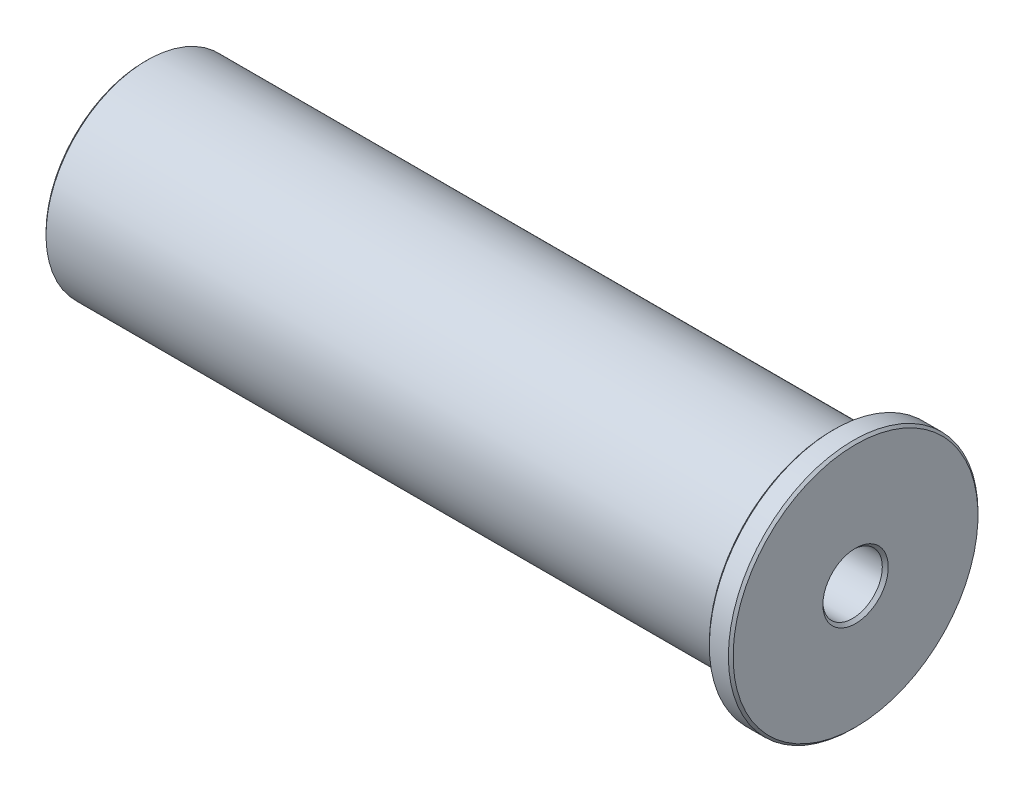
ISO-10303-21;
HEADER;
FILE_DESCRIPTION(('STEP AP214'),'2;1');
FILE_NAME('part.step','',(''),(''),'','','');
FILE_SCHEMA(('AUTOMOTIVE_DESIGN { 1 0 10303 214 1 1 1 1 }'));
ENDSEC;
DATA;
#1=APPLICATION_CONTEXT('core data for automotive mechanical design processes');
#2=APPLICATION_PROTOCOL_DEFINITION('international standard','automotive_design',2000,#1);
#3=PRODUCT_CONTEXT('',#1,'mechanical');
#4=PRODUCT('Part','Part','',(#3));
#5=PRODUCT_RELATED_PRODUCT_CATEGORY('part','',(#4));
#6=PRODUCT_DEFINITION_FORMATION('','',#4);
#7=PRODUCT_DEFINITION_CONTEXT('part definition',#1,'design');
#8=PRODUCT_DEFINITION('design','',#6,#7);
#9=PRODUCT_DEFINITION_SHAPE('','',#8);
#10=(LENGTH_UNIT() NAMED_UNIT(*) SI_UNIT(.MILLI.,.METRE.));
#11=(NAMED_UNIT(*) PLANE_ANGLE_UNIT() SI_UNIT($,.RADIAN.));
#12=(NAMED_UNIT(*) SI_UNIT($,.STERADIAN.) SOLID_ANGLE_UNIT());
#13=UNCERTAINTY_MEASURE_WITH_UNIT(LENGTH_MEASURE(1.E-05),#10,'distance_accuracy_value','');
#14=(GEOMETRIC_REPRESENTATION_CONTEXT(3) GLOBAL_UNCERTAINTY_ASSIGNED_CONTEXT((#13)) GLOBAL_UNIT_ASSIGNED_CONTEXT((#10,
#11,#12)) REPRESENTATION_CONTEXT('',''));
#15=CARTESIAN_POINT('',(0.,0.,0.));
#16=DIRECTION('',(0.,0.,1.));
#17=DIRECTION('',(1.,0.,0.));
#18=AXIS2_PLACEMENT_3D('',#15,#16,#17);
#19=CARTESIAN_POINT('',(-8.71027079588001E-13,0.,0.));
#20=DIRECTION('',(-1.,-2.04875455119457E-13,0.));
#21=DIRECTION('',(2.04875455119457E-13,-1.,0.));
#22=AXIS2_PLACEMENT_3D('',#19,#20,#21);
#23=PLANE('',#22);
#24=CARTESIAN_POINT('',(-8.71027079588001E-13,0.,0.));
#25=DIRECTION('',(-1.,-2.04875455119457E-13,0.));
#26=DIRECTION('',(2.04875455119457E-13,-1.,0.));
#27=AXIS2_PLACEMENT_3D('',#24,#25,#26);
#28=CIRCLE('',#27,8.30000000000086);
#29=CARTESIAN_POINT('',(8.29439197903669E-13,-8.30000000000086,0.));
#30=VERTEX_POINT('',#29);
#31=EDGE_CURVE('E153',#30,#30,#28,.T.);
#32=ORIENTED_EDGE('',*,*,#31,.T.);
#33=EDGE_LOOP('',(#32));
#34=FACE_BOUND('',#33,.T.);
#35=CARTESIAN_POINT('',(0.,-4.24264068711928,-4.24264068711929));
#36=DIRECTION('',(-1.,0.,0.));
#37=DIRECTION('',(0.,0.,1.));
#38=AXIS2_PLACEMENT_3D('',#35,#36,#37);
#39=CIRCLE('',#38,1.75);
#40=CARTESIAN_POINT('',(0.,-4.24264068711928,-2.49264068711929));
#41=VERTEX_POINT('',#40);
#42=EDGE_CURVE('E89',#41,#41,#39,.T.);
#43=ORIENTED_EDGE('',*,*,#42,.F.);
#44=EDGE_LOOP('',(#43));
#45=FACE_BOUND('',#44,.T.);
#46=CARTESIAN_POINT('',(0.,4.24264068711928,4.24264068711929));
#47=DIRECTION('',(-1.,0.,0.));
#48=DIRECTION('',(0.,0.,1.));
#49=AXIS2_PLACEMENT_3D('',#46,#47,#48);
#50=CIRCLE('',#49,1.75);
#51=CARTESIAN_POINT('',(0.,4.24264068711928,5.99264068711929));
#52=VERTEX_POINT('',#51);
#53=EDGE_CURVE('E82',#52,#52,#50,.T.);
#54=ORIENTED_EDGE('',*,*,#53,.F.);
#55=EDGE_LOOP('',(#54));
#56=FACE_BOUND('',#55,.T.);
#57=CARTESIAN_POINT('',(-1.22925273071673E-12,0.,6.));
#58=DIRECTION('',(-1.,0.,-2.04875455119457E-13));
#59=DIRECTION('',(-2.04875455119457E-13,0.,1.));
#60=AXIS2_PLACEMENT_3D('',#57,#58,#59);
#61=CIRCLE('',#60,1.75);
#62=CARTESIAN_POINT('',(-1.58778477717578E-12,0.,7.75));
#63=VERTEX_POINT('',#62);
#64=EDGE_CURVE('E98',#63,#63,#61,.T.);
#65=ORIENTED_EDGE('',*,*,#64,.F.);
#66=EDGE_LOOP('',(#65));
#67=FACE_BOUND('',#66,.T.);
#68=CARTESIAN_POINT('',(-2.45850546143349E-12,6.,0.));
#69=DIRECTION('',(-1.,0.,0.));
#70=DIRECTION('',(0.,0.,1.));
#71=AXIS2_PLACEMENT_3D('',#68,#69,#70);
#72=CIRCLE('',#71,1.75);
#73=CARTESIAN_POINT('',(-2.45850546143349E-12,6.,1.75));
#74=VERTEX_POINT('',#73);
#75=EDGE_CURVE('E107',#74,#74,#72,.T.);
#76=ORIENTED_EDGE('',*,*,#75,.F.);
#77=EDGE_LOOP('',(#76));
#78=FACE_BOUND('',#77,.T.);
#79=CARTESIAN_POINT('',(-1.22925273071675E-12,0.,-6.));
#80=DIRECTION('',(-1.,0.,2.04875455119457E-13));
#81=DIRECTION('',(2.04875455119457E-13,0.,1.));
#82=AXIS2_PLACEMENT_3D('',#79,#80,#81);
#83=CIRCLE('',#82,1.75);
#84=CARTESIAN_POINT('',(-8.70720684257697E-13,0.,-4.25));
#85=VERTEX_POINT('',#84);
#86=EDGE_CURVE('E116',#85,#85,#83,.T.);
#87=ORIENTED_EDGE('',*,*,#86,.F.);
#88=EDGE_LOOP('',(#87));
#89=FACE_BOUND('',#88,.T.);
#90=CARTESIAN_POINT('',(0.,-6.,0.));
#91=DIRECTION('',(-1.,0.,0.));
#92=DIRECTION('',(0.,0.,1.));
#93=AXIS2_PLACEMENT_3D('',#90,#91,#92);
#94=CIRCLE('',#93,1.75);
#95=CARTESIAN_POINT('',(0.,-6.,1.75));
#96=VERTEX_POINT('',#95);
#97=EDGE_CURVE('E125',#96,#96,#94,.T.);
#98=ORIENTED_EDGE('',*,*,#97,.F.);
#99=EDGE_LOOP('',(#98));
#100=FACE_BOUND('',#99,.T.);
#101=CARTESIAN_POINT('',(0.,0.,0.));
#102=DIRECTION('',(-1.,0.,0.));
#103=DIRECTION('',(0.,0.,1.));
#104=AXIS2_PLACEMENT_3D('',#101,#102,#103);
#105=CIRCLE('',#104,1.75);
#106=CARTESIAN_POINT('',(0.,0.,1.75));
#107=VERTEX_POINT('',#106);
#108=EDGE_CURVE('E144',#107,#107,#105,.T.);
#109=ORIENTED_EDGE('',*,*,#108,.F.);
#110=EDGE_LOOP('',(#109));
#111=FACE_BOUND('',#110,.T.);
#112=ADVANCED_FACE('F44',(#34,#45,#56,#67,#78,#89,#100,#111),#23,.T.);
#113=CARTESIAN_POINT('',(0.,0.,0.));
#114=DIRECTION('',(-1.,-2.04875455119457E-13,0.));
#115=DIRECTION('',(2.04875455119457E-13,-1.,0.));
#116=AXIS2_PLACEMENT_3D('',#113,#114,#115);
#117=CYLINDRICAL_SURFACE('',#116,8.50000000000593);
#118=CARTESIAN_POINT('',(0.200000000004205,0.,0.));
#119=DIRECTION('',(-1.,-2.04875455119457E-13,0.));
#120=DIRECTION('',(2.04875455119457E-13,-1.,0.));
#121=AXIS2_PLACEMENT_3D('',#118,#119,#120);
#122=CIRCLE('',#121,8.50000000000593);
#123=CARTESIAN_POINT('',(0.200000000005946,-8.50000000000589,0.));
#124=VERTEX_POINT('',#123);
#125=EDGE_CURVE('E158',#124,#124,#122,.F.);
#126=ORIENTED_EDGE('',*,*,#125,.T.);
#127=EDGE_LOOP('',(#126));
#128=FACE_BOUND('',#127,.T.);
#129=CARTESIAN_POINT('',(57.800430309512,1.18418894657617E-11,0.));
#130=DIRECTION('',(-1.,-2.04875455119457E-13,0.));
#131=DIRECTION('',(2.04875455119457E-13,-1.,0.));
#132=AXIS2_PLACEMENT_3D('',#129,#130,#131);
#133=CIRCLE('',#132,8.50000000001187);
#134=CARTESIAN_POINT('',(57.8004303095138,-8.50000000000003,0.));
#135=VERTEX_POINT('',#134);
#136=EDGE_CURVE('E150',#135,#135,#133,.T.);
#137=ORIENTED_EDGE('',*,*,#136,.T.);
#138=EDGE_LOOP('',(#137));
#139=FACE_BOUND('',#138,.T.);
#140=ADVANCED_FACE('F191',(#128,#139),#117,.T.);
#141=CARTESIAN_POINT('',(57.8004303095136,-8.50000000000003,0.));
#142=DIRECTION('',(-1.,-2.04875455119457E-13,0.));
#143=DIRECTION('',(2.04875455119457E-13,-1.,0.));
#144=AXIS2_PLACEMENT_3D('',#141,#142,#143);
#145=PLANE('',#144);
#146=CARTESIAN_POINT('',(57.8004303095118,1.18418894657617E-11,0.));
#147=DIRECTION('',(-1.,-2.04875455119457E-13,0.));
#148=DIRECTION('',(2.04875455119457E-13,-1.,0.));
#149=AXIS2_PLACEMENT_3D('',#146,#147,#148);
#150=CIRCLE('',#149,10.3000000000121);
#151=CARTESIAN_POINT('',(57.8004303095139,-10.3000000000002,0.));
#152=VERTEX_POINT('',#151);
#153=EDGE_CURVE('E11',#152,#152,#150,.T.);
#154=ORIENTED_EDGE('',*,*,#153,.T.);
#155=EDGE_LOOP('',(#154));
#156=FACE_BOUND('',#155,.T.);
#157=ORIENTED_EDGE('',*,*,#136,.F.);
#158=EDGE_LOOP('',(#157));
#159=FACE_BOUND('',#158,.T.);
#160=ADVANCED_FACE('F181',(#156,#159),#145,.T.);
#161=CARTESIAN_POINT('',(0.,0.,0.));
#162=DIRECTION('',(-1.,-2.04875455119457E-13,0.));
#163=DIRECTION('',(2.04875455119457E-13,-1.,0.));
#164=AXIS2_PLACEMENT_3D('',#161,#162,#163);
#165=CYLINDRICAL_SURFACE('',#164,10.500000000012);
#166=CARTESIAN_POINT('',(59.6004303095119,1.22106652849767E-11,0.));
#167=DIRECTION('',(1.,2.04875455119461E-13,0.));
#168=DIRECTION('',(-2.04875455119461E-13,1.,0.));
#169=AXIS2_PLACEMENT_3D('',#166,#167,#168);
#170=CIRCLE('',#169,10.500000000012);
#171=CARTESIAN_POINT('',(59.6004303095097,10.5000000000242,0.));
#172=VERTEX_POINT('',#171);
#173=EDGE_CURVE('E164',#172,#172,#170,.F.);
#174=ORIENTED_EDGE('',*,*,#173,.T.);
#175=EDGE_LOOP('',(#174));
#176=FACE_BOUND('',#175,.T.);
#177=CARTESIAN_POINT('',(58.0004303095118,1.18828645567856E-11,0.));
#178=DIRECTION('',(-1.,-2.04875455119454E-13,0.));
#179=DIRECTION('',(2.04875455119454E-13,-1.,0.));
#180=AXIS2_PLACEMENT_3D('',#177,#178,#179);
#181=CIRCLE('',#180,10.500000000012);
#182=CARTESIAN_POINT('',(58.000430309514,-10.5000000000001,0.));
#183=VERTEX_POINT('',#182);
#184=EDGE_CURVE('E161',#183,#183,#181,.F.);
#185=ORIENTED_EDGE('',*,*,#184,.T.);
#186=EDGE_LOOP('',(#185));
#187=FACE_BOUND('',#186,.T.);
#188=ADVANCED_FACE('F178',(#176,#187),#165,.T.);
#189=CARTESIAN_POINT('',(59.800430309512,-10.5,0.));
#190=DIRECTION('',(1.,2.04875455119457E-13,0.));
#191=DIRECTION('',(-2.04875455119457E-13,1.,0.));
#192=AXIS2_PLACEMENT_3D('',#189,#190,#191);
#193=PLANE('',#192);
#194=CARTESIAN_POINT('',(59.8004303095099,1.22516403760002E-11,0.));
#195=DIRECTION('',(1.,2.04875455119457E-13,0.));
#196=DIRECTION('',(-2.04875455119457E-13,1.,0.));
#197=AXIS2_PLACEMENT_3D('',#194,#195,#196);
#198=CIRCLE('',#197,10.300000000014);
#199=CARTESIAN_POINT('',(59.8004303095078,10.3000000000263,0.));
#200=VERTEX_POINT('',#199);
#201=EDGE_CURVE('E53',#200,#200,#198,.T.);
#202=ORIENTED_EDGE('',*,*,#201,.T.);
#203=EDGE_LOOP('',(#202));
#204=FACE_BOUND('',#203,.T.);
#205=CARTESIAN_POINT('',(59.8004303095099,1.22516403760002E-11,0.));
#206=DIRECTION('',(1.,0.,0.));
#207=DIRECTION('',(0.,0.,-1.));
#208=AXIS2_PLACEMENT_3D('',#205,#206,#207);
#209=CIRCLE('',#208,2.75);
#210=CARTESIAN_POINT('',(59.8004303095099,1.22516403760002E-11,-2.75));
#211=VERTEX_POINT('',#210);
#212=EDGE_CURVE('E134',#211,#211,#209,.T.);
#213=ORIENTED_EDGE('',*,*,#212,.F.);
#214=EDGE_LOOP('',(#213));
#215=FACE_BOUND('',#214,.T.);
#216=ADVANCED_FACE('F169',(#204,#215),#193,.T.);
#217=CARTESIAN_POINT('',(0.,0.,0.));
#218=DIRECTION('',(-1.,0.,0.));
#219=DIRECTION('',(0.,0.,1.));
#220=AXIS2_PLACEMENT_3D('',#217,#218,#219);
#221=CYLINDRICAL_SURFACE('',#220,1.49999999999999);
#222=CARTESIAN_POINT('',(12.,1.22516403760002E-11,0.));
#223=DIRECTION('',(1.,0.,0.));
#224=DIRECTION('',(0.,0.,-1.));
#225=AXIS2_PLACEMENT_3D('',#222,#223,#224);
#226=CIRCLE('',#225,1.49999999999999);
#227=CARTESIAN_POINT('',(12.,1.22516403760002E-11,-1.49999999999999));
#228=VERTEX_POINT('',#227);
#229=EDGE_CURVE('E143',#228,#228,#226,.T.);
#230=ORIENTED_EDGE('',*,*,#229,.T.);
#231=EDGE_LOOP('',(#230));
#232=FACE_BOUND('',#231,.T.);
#233=CARTESIAN_POINT('',(0.250000000000007,0.,0.));
#234=DIRECTION('',(-1.,0.,0.));
#235=DIRECTION('',(0.,0.,1.));
#236=AXIS2_PLACEMENT_3D('',#233,#234,#235);
#237=CIRCLE('',#236,1.49999999999999);
#238=CARTESIAN_POINT('',(0.250000000000007,0.,1.49999999999999));
#239=VERTEX_POINT('',#238);
#240=EDGE_CURVE('E147',#239,#239,#237,.T.);
#241=ORIENTED_EDGE('',*,*,#240,.T.);
#242=EDGE_LOOP('',(#241));
#243=FACE_BOUND('',#242,.T.);
#244=ADVANCED_FACE('F242',(#232,#243),#221,.F.);
#245=CARTESIAN_POINT('',(0.,0.,0.));
#246=DIRECTION('',(-1.,0.,0.));
#247=DIRECTION('',(0.,0.,1.));
#248=AXIS2_PLACEMENT_3D('',#245,#246,#247);
#249=CONICAL_SURFACE('',#248,1.75,0.785398163397449);
#250=ORIENTED_EDGE('',*,*,#240,.F.);
#251=EDGE_LOOP('',(#250));
#252=FACE_BOUND('',#251,.T.);
#253=ORIENTED_EDGE('',*,*,#108,.T.);
#254=EDGE_LOOP('',(#253));
#255=FACE_BOUND('',#254,.T.);
#256=ADVANCED_FACE('F239',(#252,#255),#249,.F.);
#257=CARTESIAN_POINT('',(12.6008606190276,1.22516403760002E-11,0.));
#258=DIRECTION('',(1.,0.,0.));
#259=DIRECTION('',(0.,0.,-1.));
#260=AXIS2_PLACEMENT_3D('',#257,#258,#259);
#261=CONICAL_SURFACE('',#260,2.49999999999999,1.02974425867665);
#262=CARTESIAN_POINT('',(12.6008606190276,1.22516403760002E-11,0.));
#263=DIRECTION('',(1.,0.,0.));
#264=DIRECTION('',(0.,0.,-1.));
#265=AXIS2_PLACEMENT_3D('',#262,#263,#264);
#266=CIRCLE('',#265,2.49999999999999);
#267=CARTESIAN_POINT('',(12.6008606190276,1.22516403760002E-11,-2.49999999999999));
#268=VERTEX_POINT('',#267);
#269=EDGE_CURVE('E140',#268,#268,#266,.T.);
#270=ORIENTED_EDGE('',*,*,#269,.T.);
#271=EDGE_LOOP('',(#270));
#272=FACE_BOUND('',#271,.T.);
#273=ORIENTED_EDGE('',*,*,#229,.F.);
#274=EDGE_LOOP('',(#273));
#275=FACE_BOUND('',#274,.T.);
#276=ADVANCED_FACE('F241',(#272,#275),#261,.F.);
#277=CARTESIAN_POINT('',(59.8004303095099,1.22516403760002E-11,0.));
#278=DIRECTION('',(1.,0.,0.));
#279=DIRECTION('',(0.,0.,-1.));
#280=AXIS2_PLACEMENT_3D('',#277,#278,#279);
#281=CYLINDRICAL_SURFACE('',#280,2.49999999999999);
#282=ORIENTED_EDGE('',*,*,#269,.F.);
#283=EDGE_LOOP('',(#282));
#284=FACE_BOUND('',#283,.T.);
#285=CARTESIAN_POINT('',(59.5504303095099,1.22516403760002E-11,0.));
#286=DIRECTION('',(1.,0.,0.));
#287=DIRECTION('',(0.,0.,-1.));
#288=AXIS2_PLACEMENT_3D('',#285,#286,#287);
#289=CIRCLE('',#288,2.49999999999999);
#290=CARTESIAN_POINT('',(59.5504303095099,1.22516403760002E-11,-2.49999999999999));
#291=VERTEX_POINT('',#290);
#292=EDGE_CURVE('E137',#291,#291,#289,.T.);
#293=ORIENTED_EDGE('',*,*,#292,.T.);
#294=EDGE_LOOP('',(#293));
#295=FACE_BOUND('',#294,.T.);
#296=ADVANCED_FACE('F249',(#284,#295),#281,.F.);
#297=CARTESIAN_POINT('',(59.8004303095099,1.22516403760002E-11,0.));
#298=DIRECTION('',(1.,0.,0.));
#299=DIRECTION('',(0.,0.,-1.));
#300=AXIS2_PLACEMENT_3D('',#297,#298,#299);
#301=CONICAL_SURFACE('',#300,2.75,0.785398163397459);
#302=ORIENTED_EDGE('',*,*,#292,.F.);
#303=EDGE_LOOP('',(#302));
#304=FACE_BOUND('',#303,.T.);
#305=ORIENTED_EDGE('',*,*,#212,.T.);
#306=EDGE_LOOP('',(#305));
#307=FACE_BOUND('',#306,.T.);
#308=ADVANCED_FACE('F283',(#304,#307),#301,.F.);
#309=CARTESIAN_POINT('',(8.5,-6.,0.));
#310=DIRECTION('',(-1.,0.,0.));
#311=DIRECTION('',(0.,0.,1.));
#312=AXIS2_PLACEMENT_3D('',#309,#310,#311);
#313=CONICAL_SURFACE('',#312,1.25,1.02974425867665);
#314=CARTESIAN_POINT('',(9.25107577378445,-6.,0.));
#315=VERTEX_POINT('',#314);
#316=VERTEX_LOOP('',#315);
#317=FACE_BOUND('',#316,.T.);
#318=CARTESIAN_POINT('',(8.5,-6.,0.));
#319=DIRECTION('',(-1.,0.,0.));
#320=DIRECTION('',(0.,0.,1.));
#321=AXIS2_PLACEMENT_3D('',#318,#319,#320);
#322=CIRCLE('',#321,1.25);
#323=CARTESIAN_POINT('',(8.5,-6.,1.25));
#324=VERTEX_POINT('',#323);
#325=EDGE_CURVE('E131',#324,#324,#322,.T.);
#326=ORIENTED_EDGE('',*,*,#325,.T.);
#327=EDGE_LOOP('',(#326));
#328=FACE_BOUND('',#327,.T.);
#329=ADVANCED_FACE('F292',(#317,#328),#313,.F.);
#330=CARTESIAN_POINT('',(0.,-6.,0.));
#331=DIRECTION('',(-1.,0.,0.));
#332=DIRECTION('',(0.,0.,1.));
#333=AXIS2_PLACEMENT_3D('',#330,#331,#332);
#334=CYLINDRICAL_SURFACE('',#333,1.25);
#335=ORIENTED_EDGE('',*,*,#325,.F.);
#336=EDGE_LOOP('',(#335));
#337=FACE_BOUND('',#336,.T.);
#338=CARTESIAN_POINT('',(0.500000000000001,-6.,0.));
#339=DIRECTION('',(-1.,0.,0.));
#340=DIRECTION('',(0.,0.,1.));
#341=AXIS2_PLACEMENT_3D('',#338,#339,#340);
#342=CIRCLE('',#341,1.25);
#343=CARTESIAN_POINT('',(0.500000000000001,-6.,1.25));
#344=VERTEX_POINT('',#343);
#345=EDGE_CURVE('E128',#344,#344,#342,.T.);
#346=ORIENTED_EDGE('',*,*,#345,.T.);
#347=EDGE_LOOP('',(#346));
#348=FACE_BOUND('',#347,.T.);
#349=ADVANCED_FACE('F302',(#337,#348),#334,.F.);
#350=CARTESIAN_POINT('',(0.,-6.,0.));
#351=DIRECTION('',(-1.,0.,0.));
#352=DIRECTION('',(0.,0.,1.));
#353=AXIS2_PLACEMENT_3D('',#350,#351,#352);
#354=CONICAL_SURFACE('',#353,1.75,0.785398163397447);
#355=ORIENTED_EDGE('',*,*,#345,.F.);
#356=EDGE_LOOP('',(#355));
#357=FACE_BOUND('',#356,.T.);
#358=ORIENTED_EDGE('',*,*,#97,.T.);
#359=EDGE_LOOP('',(#358));
#360=FACE_BOUND('',#359,.T.);
#361=ADVANCED_FACE('F312',(#357,#360),#354,.F.);
#362=CARTESIAN_POINT('',(8.49999999999877,0.,-6.00000000000174));
#363=DIRECTION('',(-1.,0.,2.04875455119457E-13));
#364=DIRECTION('',(2.04875455119457E-13,0.,1.));
#365=AXIS2_PLACEMENT_3D('',#362,#363,#364);
#366=CONICAL_SURFACE('',#365,1.25,1.02974425867665);
#367=CARTESIAN_POINT('',(9.25107577378322,0.,-6.00000000000189));
#368=VERTEX_POINT('',#367);
#369=VERTEX_LOOP('',#368);
#370=FACE_BOUND('',#369,.T.);
#371=CARTESIAN_POINT('',(8.49999999999877,0.,-6.00000000000174));
#372=DIRECTION('',(-1.,0.,2.04875455119457E-13));
#373=DIRECTION('',(2.04875455119457E-13,0.,1.));
#374=AXIS2_PLACEMENT_3D('',#371,#372,#373);
#375=CIRCLE('',#374,1.25);
#376=CARTESIAN_POINT('',(8.49999999999903,0.,-4.75000000000174));
#377=VERTEX_POINT('',#376);
#378=EDGE_CURVE('E122',#377,#377,#375,.T.);
#379=ORIENTED_EDGE('',*,*,#378,.T.);
#380=EDGE_LOOP('',(#379));
#381=FACE_BOUND('',#380,.T.);
#382=ADVANCED_FACE('F326',(#370,#381),#366,.F.);
#383=CARTESIAN_POINT('',(-1.22925273071675E-12,0.,-6.));
#384=DIRECTION('',(-1.,0.,2.04875455119457E-13));
#385=DIRECTION('',(2.04875455119457E-13,0.,1.));
#386=AXIS2_PLACEMENT_3D('',#383,#384,#385);
#387=CYLINDRICAL_SURFACE('',#386,1.25);
#388=ORIENTED_EDGE('',*,*,#378,.F.);
#389=EDGE_LOOP('',(#388));
#390=FACE_BOUND('',#389,.T.);
#391=CARTESIAN_POINT('',(0.499999999998772,0.,-6.0000000000001));
#392=DIRECTION('',(-1.,0.,2.04875455119457E-13));
#393=DIRECTION('',(2.04875455119457E-13,0.,1.));
#394=AXIS2_PLACEMENT_3D('',#391,#392,#393);
#395=CIRCLE('',#394,1.25);
#396=CARTESIAN_POINT('',(0.499999999999028,0.,-4.7500000000001));
#397=VERTEX_POINT('',#396);
#398=EDGE_CURVE('E119',#397,#397,#395,.T.);
#399=ORIENTED_EDGE('',*,*,#398,.T.);
#400=EDGE_LOOP('',(#399));
#401=FACE_BOUND('',#400,.T.);
#402=ADVANCED_FACE('F337',(#390,#401),#387,.F.);
#403=CARTESIAN_POINT('',(-1.22925273071675E-12,0.,-6.));
#404=DIRECTION('',(-1.,0.,2.04875455119457E-13));
#405=DIRECTION('',(2.04875455119457E-13,0.,1.));
#406=AXIS2_PLACEMENT_3D('',#403,#404,#405);
#407=CONICAL_SURFACE('',#406,1.75,0.785398163397448);
#408=ORIENTED_EDGE('',*,*,#398,.F.);
#409=EDGE_LOOP('',(#408));
#410=FACE_BOUND('',#409,.T.);
#411=ORIENTED_EDGE('',*,*,#86,.T.);
#412=EDGE_LOOP('',(#411));
#413=FACE_BOUND('',#412,.T.);
#414=ADVANCED_FACE('F347',(#410,#413),#407,.F.);
#415=CARTESIAN_POINT('',(8.49999999999754,6.,0.));
#416=DIRECTION('',(-1.,0.,0.));
#417=DIRECTION('',(0.,0.,1.));
#418=AXIS2_PLACEMENT_3D('',#415,#416,#417);
#419=CONICAL_SURFACE('',#418,1.25,1.02974425867665);
#420=CARTESIAN_POINT('',(9.251075773782,6.,0.));
#421=VERTEX_POINT('',#420);
#422=VERTEX_LOOP('',#421);
#423=FACE_BOUND('',#422,.T.);
#424=CARTESIAN_POINT('',(8.49999999999754,6.,0.));
#425=DIRECTION('',(-1.,0.,0.));
#426=DIRECTION('',(0.,0.,1.));
#427=AXIS2_PLACEMENT_3D('',#424,#425,#426);
#428=CIRCLE('',#427,1.25);
#429=CARTESIAN_POINT('',(8.49999999999754,6.,1.25));
#430=VERTEX_POINT('',#429);
#431=EDGE_CURVE('E113',#430,#430,#428,.T.);
#432=ORIENTED_EDGE('',*,*,#431,.T.);
#433=EDGE_LOOP('',(#432));
#434=FACE_BOUND('',#433,.T.);
#435=ADVANCED_FACE('F361',(#423,#434),#419,.F.);
#436=CARTESIAN_POINT('',(-2.45850546143349E-12,6.,0.));
#437=DIRECTION('',(-1.,0.,0.));
#438=DIRECTION('',(0.,0.,1.));
#439=AXIS2_PLACEMENT_3D('',#436,#437,#438);
#440=CYLINDRICAL_SURFACE('',#439,1.25);
#441=ORIENTED_EDGE('',*,*,#431,.F.);
#442=EDGE_LOOP('',(#441));
#443=FACE_BOUND('',#442,.T.);
#444=CARTESIAN_POINT('',(0.499999999997543,6.,0.));
#445=DIRECTION('',(-1.,0.,0.));
#446=DIRECTION('',(0.,0.,1.));
#447=AXIS2_PLACEMENT_3D('',#444,#445,#446);
#448=CIRCLE('',#447,1.25);
#449=CARTESIAN_POINT('',(0.499999999997543,6.,1.25));
#450=VERTEX_POINT('',#449);
#451=EDGE_CURVE('E110',#450,#450,#448,.T.);
#452=ORIENTED_EDGE('',*,*,#451,.T.);
#453=EDGE_LOOP('',(#452));
#454=FACE_BOUND('',#453,.T.);
#455=ADVANCED_FACE('F373',(#443,#454),#440,.F.);
#456=CARTESIAN_POINT('',(-2.45850546143349E-12,6.,0.));
#457=DIRECTION('',(-1.,0.,0.));
#458=DIRECTION('',(0.,0.,1.));
#459=AXIS2_PLACEMENT_3D('',#456,#457,#458);
#460=CONICAL_SURFACE('',#459,1.75,0.785398163397447);
#461=ORIENTED_EDGE('',*,*,#451,.F.);
#462=EDGE_LOOP('',(#461));
#463=FACE_BOUND('',#462,.T.);
#464=ORIENTED_EDGE('',*,*,#75,.T.);
#465=EDGE_LOOP('',(#464));
#466=FACE_BOUND('',#465,.T.);
#467=ADVANCED_FACE('F384',(#463,#466),#460,.F.);
#468=CARTESIAN_POINT('',(8.49999999999877,0.,6.00000000000174));
#469=DIRECTION('',(-1.,0.,-2.04875455119457E-13));
#470=DIRECTION('',(-2.04875455119457E-13,0.,1.));
#471=AXIS2_PLACEMENT_3D('',#468,#469,#470);
#472=CONICAL_SURFACE('',#471,1.25,1.02974425867665);
#473=CARTESIAN_POINT('',(9.25107577378322,0.,6.00000000000189));
#474=VERTEX_POINT('',#473);
#475=VERTEX_LOOP('',#474);
#476=FACE_BOUND('',#475,.T.);
#477=CARTESIAN_POINT('',(8.49999999999877,0.,6.00000000000174));
#478=DIRECTION('',(-1.,0.,-2.04875455119457E-13));
#479=DIRECTION('',(-2.04875455119457E-13,0.,1.));
#480=AXIS2_PLACEMENT_3D('',#477,#478,#479);
#481=CIRCLE('',#480,1.25);
#482=CARTESIAN_POINT('',(8.49999999999851,0.,7.25000000000174));
#483=VERTEX_POINT('',#482);
#484=EDGE_CURVE('E104',#483,#483,#481,.T.);
#485=ORIENTED_EDGE('',*,*,#484,.T.);
#486=EDGE_LOOP('',(#485));
#487=FACE_BOUND('',#486,.T.);
#488=ADVANCED_FACE('F395',(#476,#487),#472,.F.);
#489=CARTESIAN_POINT('',(-1.22925273071673E-12,0.,6.));
#490=DIRECTION('',(-1.,0.,-2.04875455119457E-13));
#491=DIRECTION('',(-2.04875455119457E-13,0.,1.));
#492=AXIS2_PLACEMENT_3D('',#489,#490,#491);
#493=CYLINDRICAL_SURFACE('',#492,1.25);
#494=ORIENTED_EDGE('',*,*,#484,.F.);
#495=EDGE_LOOP('',(#494));
#496=FACE_BOUND('',#495,.T.);
#497=CARTESIAN_POINT('',(0.499999999998772,0.,6.0000000000001));
#498=DIRECTION('',(-1.,0.,-2.04875455119457E-13));
#499=DIRECTION('',(-2.04875455119457E-13,0.,1.));
#500=AXIS2_PLACEMENT_3D('',#497,#498,#499);
#501=CIRCLE('',#500,1.25);
#502=CARTESIAN_POINT('',(0.499999999998516,0.,7.2500000000001));
#503=VERTEX_POINT('',#502);
#504=EDGE_CURVE('E101',#503,#503,#501,.T.);
#505=ORIENTED_EDGE('',*,*,#504,.T.);
#506=EDGE_LOOP('',(#505));
#507=FACE_BOUND('',#506,.T.);
#508=ADVANCED_FACE('F406',(#496,#507),#493,.F.);
#509=CARTESIAN_POINT('',(-1.22925273071673E-12,0.,6.));
#510=DIRECTION('',(-1.,0.,-2.04875455119457E-13));
#511=DIRECTION('',(-2.04875455119457E-13,0.,1.));
#512=AXIS2_PLACEMENT_3D('',#509,#510,#511);
#513=CONICAL_SURFACE('',#512,1.75,0.785398163397448);
#514=ORIENTED_EDGE('',*,*,#504,.F.);
#515=EDGE_LOOP('',(#514));
#516=FACE_BOUND('',#515,.T.);
#517=ORIENTED_EDGE('',*,*,#64,.T.);
#518=EDGE_LOOP('',(#517));
#519=FACE_BOUND('',#518,.T.);
#520=ADVANCED_FACE('F416',(#516,#519),#513,.F.);
#521=CARTESIAN_POINT('',(8.,4.24264068711928,4.24264068711929));
#522=DIRECTION('',(-1.,0.,0.));
#523=DIRECTION('',(0.,0.,1.));
#524=AXIS2_PLACEMENT_3D('',#521,#522,#523);
#525=CONICAL_SURFACE('',#524,1.5,1.02974425867665);
#526=CARTESIAN_POINT('',(8.90129092854134,4.24264068711928,4.24264068711929));
#527=VERTEX_POINT('',#526);
#528=VERTEX_LOOP('',#527);
#529=FACE_BOUND('',#528,.T.);
#530=CARTESIAN_POINT('',(8.,4.24264068711928,4.24264068711929));
#531=DIRECTION('',(-1.,0.,0.));
#532=DIRECTION('',(0.,0.,1.));
#533=AXIS2_PLACEMENT_3D('',#530,#531,#532);
#534=CIRCLE('',#533,1.5);
#535=CARTESIAN_POINT('',(8.,4.24264068711928,5.74264068711929));
#536=VERTEX_POINT('',#535);
#537=EDGE_CURVE('E95',#536,#536,#534,.T.);
#538=ORIENTED_EDGE('',*,*,#537,.T.);
#539=EDGE_LOOP('',(#538));
#540=FACE_BOUND('',#539,.T.);
#541=ADVANCED_FACE('F427',(#529,#540),#525,.F.);
#542=CARTESIAN_POINT('',(0.,4.24264068711928,4.24264068711929));
#543=DIRECTION('',(-1.,0.,0.));
#544=DIRECTION('',(0.,0.,1.));
#545=AXIS2_PLACEMENT_3D('',#542,#543,#544);
#546=CYLINDRICAL_SURFACE('',#545,1.5);
#547=ORIENTED_EDGE('',*,*,#537,.F.);
#548=EDGE_LOOP('',(#547));
#549=FACE_BOUND('',#548,.T.);
#550=CARTESIAN_POINT('',(0.25,4.24264068711928,4.24264068711929));
#551=DIRECTION('',(-1.,0.,0.));
#552=DIRECTION('',(0.,0.,1.));
#553=AXIS2_PLACEMENT_3D('',#550,#551,#552);
#554=CIRCLE('',#553,1.5);
#555=CARTESIAN_POINT('',(0.25,4.24264068711928,5.74264068711929));
#556=VERTEX_POINT('',#555);
#557=EDGE_CURVE('E86',#556,#556,#554,.T.);
#558=ORIENTED_EDGE('',*,*,#557,.T.);
#559=EDGE_LOOP('',(#558));
#560=FACE_BOUND('',#559,.T.);
#561=ADVANCED_FACE('F438',(#549,#560),#546,.F.);
#562=CARTESIAN_POINT('',(0.,4.24264068711928,4.24264068711929));
#563=DIRECTION('',(-1.,0.,0.));
#564=DIRECTION('',(0.,0.,1.));
#565=AXIS2_PLACEMENT_3D('',#562,#563,#564);
#566=CONICAL_SURFACE('',#565,1.75,0.78539816339745);
#567=ORIENTED_EDGE('',*,*,#557,.F.);
#568=EDGE_LOOP('',(#567));
#569=FACE_BOUND('',#568,.T.);
#570=ORIENTED_EDGE('',*,*,#53,.T.);
#571=EDGE_LOOP('',(#570));
#572=FACE_BOUND('',#571,.T.);
#573=ADVANCED_FACE('F76',(#569,#572),#566,.F.);
#574=CARTESIAN_POINT('',(8.,-4.24264068711928,-4.24264068711929));
#575=DIRECTION('',(-1.,0.,0.));
#576=DIRECTION('',(0.,0.,1.));
#577=AXIS2_PLACEMENT_3D('',#574,#575,#576);
#578=CONICAL_SURFACE('',#577,1.5,1.02974425867665);
#579=CARTESIAN_POINT('',(8.90129092854134,-4.24264068711928,-4.24264068711929));
#580=VERTEX_POINT('',#579);
#581=VERTEX_LOOP('',#580);
#582=FACE_BOUND('',#581,.T.);
#583=CARTESIAN_POINT('',(8.,-4.24264068711928,-4.24264068711929));
#584=DIRECTION('',(-1.,0.,0.));
#585=DIRECTION('',(0.,0.,1.));
#586=AXIS2_PLACEMENT_3D('',#583,#584,#585);
#587=CIRCLE('',#586,1.5);
#588=CARTESIAN_POINT('',(8.,-4.24264068711928,-2.74264068711929));
#589=VERTEX_POINT('',#588);
#590=EDGE_CURVE('E80',#589,#589,#587,.T.);
#591=ORIENTED_EDGE('',*,*,#590,.T.);
#592=EDGE_LOOP('',(#591));
#593=FACE_BOUND('',#592,.T.);
#594=ADVANCED_FACE('F72',(#582,#593),#578,.F.);
#595=CARTESIAN_POINT('',(0.,-4.24264068711928,-4.24264068711929));
#596=DIRECTION('',(-1.,0.,0.));
#597=DIRECTION('',(0.,0.,1.));
#598=AXIS2_PLACEMENT_3D('',#595,#596,#597);
#599=CYLINDRICAL_SURFACE('',#598,1.5);
#600=ORIENTED_EDGE('',*,*,#590,.F.);
#601=EDGE_LOOP('',(#600));
#602=FACE_BOUND('',#601,.T.);
#603=CARTESIAN_POINT('',(0.25,-4.24264068711928,-4.24264068711929));
#604=DIRECTION('',(-1.,0.,0.));
#605=DIRECTION('',(0.,0.,1.));
#606=AXIS2_PLACEMENT_3D('',#603,#604,#605);
#607=CIRCLE('',#606,1.5);
#608=CARTESIAN_POINT('',(0.25,-4.24264068711928,-2.74264068711929));
#609=VERTEX_POINT('',#608);
#610=EDGE_CURVE('E83',#609,#609,#607,.T.);
#611=ORIENTED_EDGE('',*,*,#610,.T.);
#612=EDGE_LOOP('',(#611));
#613=FACE_BOUND('',#612,.T.);
#614=ADVANCED_FACE('F75',(#602,#613),#599,.F.);
#615=CARTESIAN_POINT('',(0.,-4.24264068711928,-4.24264068711929));
#616=DIRECTION('',(-1.,0.,0.));
#617=DIRECTION('',(0.,0.,1.));
#618=AXIS2_PLACEMENT_3D('',#615,#616,#617);
#619=CONICAL_SURFACE('',#618,1.75,0.785398163397449);
#620=ORIENTED_EDGE('',*,*,#610,.F.);
#621=EDGE_LOOP('',(#620));
#622=FACE_BOUND('',#621,.T.);
#623=ORIENTED_EDGE('',*,*,#42,.T.);
#624=EDGE_LOOP('',(#623));
#625=FACE_BOUND('',#624,.T.);
#626=ADVANCED_FACE('F209',(#622,#625),#619,.F.);
#627=CARTESIAN_POINT('',(-8.71027079588001E-13,0.,0.));
#628=DIRECTION('',(1.,2.04875455119457E-13,0.));
#629=DIRECTION('',(-2.04875455119457E-13,1.,0.));
#630=AXIS2_PLACEMENT_3D('',#627,#628,#629);
#631=CONICAL_SURFACE('',#630,8.30000000000086,0.785398163397454);
#632=ORIENTED_EDGE('',*,*,#125,.F.);
#633=EDGE_LOOP('',(#632));
#634=FACE_BOUND('',#633,.T.);
#635=ORIENTED_EDGE('',*,*,#31,.F.);
#636=EDGE_LOOP('',(#635));
#637=FACE_BOUND('',#636,.T.);
#638=ADVANCED_FACE('F175',(#634,#637),#631,.T.);
#639=CARTESIAN_POINT('',(59.6004303095119,1.22106652849767E-11,0.));
#640=DIRECTION('',(-1.,-2.04875455119461E-13,0.));
#641=DIRECTION('',(2.04875455119461E-13,-1.,0.));
#642=AXIS2_PLACEMENT_3D('',#639,#640,#641);
#643=CONICAL_SURFACE('',#642,10.500000000012,0.78539816339744);
#644=ORIENTED_EDGE('',*,*,#201,.F.);
#645=EDGE_LOOP('',(#644));
#646=FACE_BOUND('',#645,.T.);
#647=ORIENTED_EDGE('',*,*,#173,.F.);
#648=EDGE_LOOP('',(#647));
#649=FACE_BOUND('',#648,.T.);
#650=ADVANCED_FACE('F172',(#646,#649),#643,.T.);
#651=CARTESIAN_POINT('',(57.8004303095118,1.18418894657617E-11,0.));
#652=DIRECTION('',(1.,2.04875455119454E-13,0.));
#653=DIRECTION('',(-2.04875455119454E-13,1.,0.));
#654=AXIS2_PLACEMENT_3D('',#651,#652,#653);
#655=CONICAL_SURFACE('',#654,10.3000000000121,0.785398163397457);
#656=ORIENTED_EDGE('',*,*,#184,.F.);
#657=EDGE_LOOP('',(#656));
#658=FACE_BOUND('',#657,.T.);
#659=ORIENTED_EDGE('',*,*,#153,.F.);
#660=EDGE_LOOP('',(#659));
#661=FACE_BOUND('',#660,.T.);
#662=ADVANCED_FACE('F47',(#658,#661),#655,.T.);
#663=CLOSED_SHELL('',(#112,#140,#160,#188,#216,#244,#256,#276,#296,#308,#329,#349,#361,#382,
#402,#414,#435,#455,#467,#488,#508,#520,#541,#561,#573,#594,#614,#626,#638,#650,#662));
#664=MANIFOLD_SOLID_BREP('B2',#663);
#665=ADVANCED_BREP_SHAPE_REPRESENTATION('',(#18,#664),#14);
#666=SHAPE_DEFINITION_REPRESENTATION(#9,#665);
ENDSEC;
END-ISO-10303-21;
